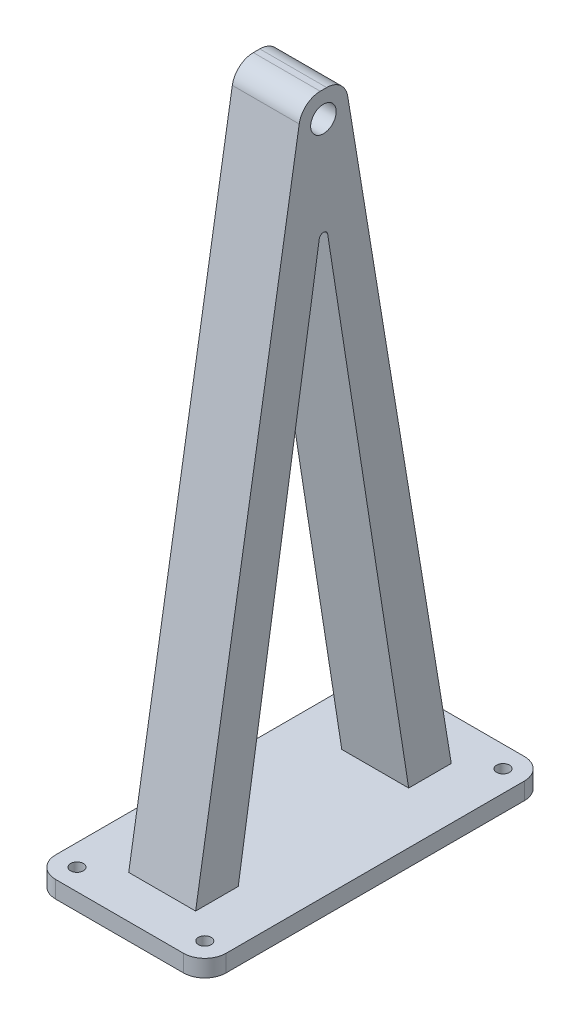
ISO-10303-21;
HEADER;
FILE_DESCRIPTION(('STEP AP214'),'2;1');
FILE_NAME('part.step','',(''),(''),'','','');
FILE_SCHEMA(('AUTOMOTIVE_DESIGN { 1 0 10303 214 1 1 1 1 }'));
ENDSEC;
DATA;
#1=APPLICATION_CONTEXT('core data for automotive mechanical design processes');
#2=APPLICATION_PROTOCOL_DEFINITION('international standard','automotive_design',2000,#1);
#3=PRODUCT_CONTEXT('',#1,'mechanical');
#4=PRODUCT('Part','Part','',(#3));
#5=PRODUCT_RELATED_PRODUCT_CATEGORY('part','',(#4));
#6=PRODUCT_DEFINITION_FORMATION('','',#4);
#7=PRODUCT_DEFINITION_CONTEXT('part definition',#1,'design');
#8=PRODUCT_DEFINITION('design','',#6,#7);
#9=PRODUCT_DEFINITION_SHAPE('','',#8);
#10=(LENGTH_UNIT() NAMED_UNIT(*) SI_UNIT(.MILLI.,.METRE.));
#11=(NAMED_UNIT(*) PLANE_ANGLE_UNIT() SI_UNIT($,.RADIAN.));
#12=(NAMED_UNIT(*) SI_UNIT($,.STERADIAN.) SOLID_ANGLE_UNIT());
#13=UNCERTAINTY_MEASURE_WITH_UNIT(LENGTH_MEASURE(1.E-05),#10,'distance_accuracy_value','');
#14=(GEOMETRIC_REPRESENTATION_CONTEXT(3) GLOBAL_UNCERTAINTY_ASSIGNED_CONTEXT((#13)) GLOBAL_UNIT_ASSIGNED_CONTEXT((#10,
#11,#12)) REPRESENTATION_CONTEXT('',''));
#15=CARTESIAN_POINT('',(0.,0.,0.));
#16=DIRECTION('',(0.,0.,1.));
#17=DIRECTION('',(1.,0.,0.));
#18=AXIS2_PLACEMENT_3D('',#15,#16,#17);
#19=CARTESIAN_POINT('',(0.,4.,0.));
#20=DIRECTION('',(0.,-1.,0.));
#21=DIRECTION('',(0.,0.,-1.));
#22=AXIS2_PLACEMENT_3D('',#19,#20,#21);
#23=PLANE('',#22);
#24=DIRECTION('',(0.,0.,1.));
#25=VECTOR('',#24,1.);
#26=CARTESIAN_POINT('',(0.,4.,0.));
#27=LINE('',#26,#25);
#28=CARTESIAN_POINT('',(0.,4.,-75.));
#29=VERTEX_POINT('',#28);
#30=CARTESIAN_POINT('',(0.,4.,-5.));
#31=VERTEX_POINT('',#30);
#32=EDGE_CURVE('E223',#29,#31,#27,.T.);
#33=ORIENTED_EDGE('',*,*,#32,.T.);
#34=CARTESIAN_POINT('',(5.,4.,-5.));
#35=DIRECTION('',(0.,-1.,0.));
#36=DIRECTION('',(0.,0.,-1.));
#37=AXIS2_PLACEMENT_3D('',#34,#35,#36);
#38=CIRCLE('',#37,5.);
#39=CARTESIAN_POINT('',(5.,4.,0.));
#40=VERTEX_POINT('',#39);
#41=EDGE_CURVE('E265',#31,#40,#38,.F.);
#42=ORIENTED_EDGE('',*,*,#41,.T.);
#43=DIRECTION('',(1.,0.,0.));
#44=VECTOR('',#43,1.);
#45=CARTESIAN_POINT('',(0.,4.,0.));
#46=LINE('',#45,#44);
#47=CARTESIAN_POINT('',(35.,4.,0.));
#48=VERTEX_POINT('',#47);
#49=EDGE_CURVE('E225',#40,#48,#46,.T.);
#50=ORIENTED_EDGE('',*,*,#49,.T.);
#51=CARTESIAN_POINT('',(35.,4.,-5.));
#52=DIRECTION('',(0.,-1.,0.));
#53=DIRECTION('',(0.,0.,-1.));
#54=AXIS2_PLACEMENT_3D('',#51,#52,#53);
#55=CIRCLE('',#54,5.);
#56=CARTESIAN_POINT('',(40.,4.,-5.));
#57=VERTEX_POINT('',#56);
#58=EDGE_CURVE('E267',#48,#57,#55,.F.);
#59=ORIENTED_EDGE('',*,*,#58,.T.);
#60=DIRECTION('',(0.,0.,-1.));
#61=VECTOR('',#60,1.);
#62=CARTESIAN_POINT('',(40.,4.,0.));
#63=LINE('',#62,#61);
#64=CARTESIAN_POINT('',(40.,4.,-75.));
#65=VERTEX_POINT('',#64);
#66=EDGE_CURVE('E229',#57,#65,#63,.T.);
#67=ORIENTED_EDGE('',*,*,#66,.T.);
#68=CARTESIAN_POINT('',(35.,4.,-75.));
#69=DIRECTION('',(0.,-1.,0.));
#70=DIRECTION('',(0.,0.,-1.));
#71=AXIS2_PLACEMENT_3D('',#68,#69,#70);
#72=CIRCLE('',#71,5.);
#73=CARTESIAN_POINT('',(35.,4.,-80.));
#74=VERTEX_POINT('',#73);
#75=EDGE_CURVE('E269',#65,#74,#72,.F.);
#76=ORIENTED_EDGE('',*,*,#75,.T.);
#77=DIRECTION('',(-1.,0.,0.));
#78=VECTOR('',#77,1.);
#79=CARTESIAN_POINT('',(0.,4.,-80.));
#80=LINE('',#79,#78);
#81=CARTESIAN_POINT('',(5.,4.,-80.));
#82=VERTEX_POINT('',#81);
#83=EDGE_CURVE('E231',#74,#82,#80,.T.);
#84=ORIENTED_EDGE('',*,*,#83,.T.);
#85=CARTESIAN_POINT('',(5.,4.,-75.));
#86=DIRECTION('',(0.,-1.,0.));
#87=DIRECTION('',(0.,0.,-1.));
#88=AXIS2_PLACEMENT_3D('',#85,#86,#87);
#89=CIRCLE('',#88,5.);
#90=EDGE_CURVE('E263',#82,#29,#89,.F.);
#91=ORIENTED_EDGE('',*,*,#90,.T.);
#92=EDGE_LOOP('',(#33,#42,#50,#59,#67,#76,#84,#91));
#93=FACE_BOUND('',#92,.T.);
#94=DIRECTION('',(1.,0.,0.));
#95=VECTOR('',#94,1.);
#96=CARTESIAN_POINT('',(-132.15,4.,-60.));
#97=LINE('',#96,#95);
#98=CARTESIAN_POINT('',(12.15,4.,-60.));
#99=VERTEX_POINT('',#98);
#100=CARTESIAN_POINT('',(27.85,3.99999999999999,-60.));
#101=VERTEX_POINT('',#100);
#102=EDGE_CURVE('E172',#99,#101,#97,.T.);
#103=ORIENTED_EDGE('',*,*,#102,.F.);
#104=DIRECTION('',(0.,0.,1.));
#105=VECTOR('',#104,1.);
#106=CARTESIAN_POINT('',(12.15,4.,-70.));
#107=LINE('',#106,#105);
#108=CARTESIAN_POINT('',(12.15,4.,-70.));
#109=VERTEX_POINT('',#108);
#110=EDGE_CURVE('E326',#109,#99,#107,.T.);
#111=ORIENTED_EDGE('',*,*,#110,.F.);
#112=DIRECTION('',(-1.,0.,0.));
#113=VECTOR('',#112,1.);
#114=CARTESIAN_POINT('',(12.15,4.,-70.));
#115=LINE('',#114,#113);
#116=CARTESIAN_POINT('',(27.85,4.,-70.));
#117=VERTEX_POINT('',#116);
#118=EDGE_CURVE('E187',#117,#109,#115,.T.);
#119=ORIENTED_EDGE('',*,*,#118,.F.);
#120=DIRECTION('',(0.,0.,-1.));
#121=VECTOR('',#120,1.);
#122=CARTESIAN_POINT('',(27.85,4.,-70.));
#123=LINE('',#122,#121);
#124=EDGE_CURVE('E188',#101,#117,#123,.T.);
#125=ORIENTED_EDGE('',*,*,#124,.F.);
#126=EDGE_LOOP('',(#103,#111,#119,#125));
#127=FACE_BOUND('',#126,.T.);
#128=CARTESIAN_POINT('',(35.,4.,-5.));
#129=DIRECTION('',(0.,1.,0.));
#130=DIRECTION('',(0.,0.,1.));
#131=AXIS2_PLACEMENT_3D('',#128,#129,#130);
#132=CIRCLE('',#131,1.5);
#133=CARTESIAN_POINT('',(35.,4.,-3.5));
#134=VERTEX_POINT('',#133);
#135=EDGE_CURVE('E197',#134,#134,#132,.T.);
#136=ORIENTED_EDGE('',*,*,#135,.F.);
#137=EDGE_LOOP('',(#136));
#138=FACE_BOUND('',#137,.T.);
#139=CARTESIAN_POINT('',(5.,4.,-5.));
#140=DIRECTION('',(0.,1.,0.));
#141=DIRECTION('',(0.,0.,1.));
#142=AXIS2_PLACEMENT_3D('',#139,#140,#141);
#143=CIRCLE('',#142,1.5);
#144=CARTESIAN_POINT('',(5.,4.,-3.5));
#145=VERTEX_POINT('',#144);
#146=EDGE_CURVE('E205',#145,#145,#143,.T.);
#147=ORIENTED_EDGE('',*,*,#146,.F.);
#148=EDGE_LOOP('',(#147));
#149=FACE_BOUND('',#148,.T.);
#150=CARTESIAN_POINT('',(12.15,4.,-20.));
#151=VERTEX_POINT('',#150);
#152=CARTESIAN_POINT('',(12.15,4.,-10.));
#153=VERTEX_POINT('',#152);
#154=EDGE_CURVE('E180',#151,#153,#107,.T.);
#155=ORIENTED_EDGE('',*,*,#154,.F.);
#156=DIRECTION('',(1.,0.,0.));
#157=VECTOR('',#156,1.);
#158=CARTESIAN_POINT('',(-132.15,4.,-20.));
#159=LINE('',#158,#157);
#160=CARTESIAN_POINT('',(27.85,4.,-20.));
#161=VERTEX_POINT('',#160);
#162=EDGE_CURVE('E167',#151,#161,#159,.T.);
#163=ORIENTED_EDGE('',*,*,#162,.T.);
#164=CARTESIAN_POINT('',(27.85,4.,-10.));
#165=VERTEX_POINT('',#164);
#166=EDGE_CURVE('E179',#165,#161,#123,.T.);
#167=ORIENTED_EDGE('',*,*,#166,.F.);
#168=DIRECTION('',(1.,0.,0.));
#169=VECTOR('',#168,1.);
#170=CARTESIAN_POINT('',(12.15,4.,-10.));
#171=LINE('',#170,#169);
#172=EDGE_CURVE('E193',#153,#165,#171,.T.);
#173=ORIENTED_EDGE('',*,*,#172,.F.);
#174=EDGE_LOOP('',(#155,#163,#167,#173));
#175=FACE_BOUND('',#174,.T.);
#176=CARTESIAN_POINT('',(5.,4.,-75.));
#177=DIRECTION('',(0.,1.,0.));
#178=DIRECTION('',(0.,0.,1.));
#179=AXIS2_PLACEMENT_3D('',#176,#177,#178);
#180=CIRCLE('',#179,1.54);
#181=CARTESIAN_POINT('',(5.,4.,-73.46));
#182=VERTEX_POINT('',#181);
#183=EDGE_CURVE('E217',#182,#182,#180,.T.);
#184=ORIENTED_EDGE('',*,*,#183,.F.);
#185=EDGE_LOOP('',(#184));
#186=FACE_BOUND('',#185,.T.);
#187=CARTESIAN_POINT('',(35.,4.,-75.));
#188=DIRECTION('',(0.,1.,0.));
#189=DIRECTION('',(0.,0.,1.));
#190=AXIS2_PLACEMENT_3D('',#187,#188,#189);
#191=CIRCLE('',#190,1.5);
#192=CARTESIAN_POINT('',(35.,4.,-73.5));
#193=VERTEX_POINT('',#192);
#194=EDGE_CURVE('E211',#193,#193,#191,.T.);
#195=ORIENTED_EDGE('',*,*,#194,.F.);
#196=EDGE_LOOP('',(#195));
#197=FACE_BOUND('',#196,.T.);
#198=ADVANCED_FACE('F39',(#93,#127,#138,#149,#175,#186,#197),#23,.F.);
#199=CARTESIAN_POINT('',(0.,0.,0.));
#200=DIRECTION('',(0.,-1.,0.));
#201=DIRECTION('',(0.,0.,-1.));
#202=AXIS2_PLACEMENT_3D('',#199,#200,#201);
#203=PLANE('',#202);
#204=CARTESIAN_POINT('',(5.,0.,-5.));
#205=DIRECTION('',(0.,1.,0.));
#206=DIRECTION('',(0.,0.,1.));
#207=AXIS2_PLACEMENT_3D('',#204,#205,#206);
#208=CIRCLE('',#207,1.5);
#209=CARTESIAN_POINT('',(5.,0.,-3.5));
#210=VERTEX_POINT('',#209);
#211=EDGE_CURVE('E200',#210,#210,#208,.T.);
#212=ORIENTED_EDGE('',*,*,#211,.T.);
#213=EDGE_LOOP('',(#212));
#214=FACE_BOUND('',#213,.T.);
#215=CARTESIAN_POINT('',(5.,0.,-75.));
#216=DIRECTION('',(0.,1.,0.));
#217=DIRECTION('',(0.,0.,1.));
#218=AXIS2_PLACEMENT_3D('',#215,#216,#217);
#219=CIRCLE('',#218,1.54);
#220=CARTESIAN_POINT('',(5.,0.,-73.46));
#221=VERTEX_POINT('',#220);
#222=EDGE_CURVE('E214',#221,#221,#219,.T.);
#223=ORIENTED_EDGE('',*,*,#222,.T.);
#224=EDGE_LOOP('',(#223));
#225=FACE_BOUND('',#224,.T.);
#226=DIRECTION('',(-1.,0.,0.));
#227=VECTOR('',#226,1.);
#228=CARTESIAN_POINT('',(0.,0.,-80.));
#229=LINE('',#228,#227);
#230=CARTESIAN_POINT('',(35.,0.,-80.));
#231=VERTEX_POINT('',#230);
#232=CARTESIAN_POINT('',(5.,0.,-80.));
#233=VERTEX_POINT('',#232);
#234=EDGE_CURVE('E226',#231,#233,#229,.T.);
#235=ORIENTED_EDGE('',*,*,#234,.F.);
#236=CARTESIAN_POINT('',(35.,0.,-75.));
#237=DIRECTION('',(0.,-1.,0.));
#238=DIRECTION('',(0.,0.,-1.));
#239=AXIS2_PLACEMENT_3D('',#236,#237,#238);
#240=CIRCLE('',#239,5.);
#241=CARTESIAN_POINT('',(40.,0.,-75.));
#242=VERTEX_POINT('',#241);
#243=EDGE_CURVE('E255',#231,#242,#240,.T.);
#244=ORIENTED_EDGE('',*,*,#243,.T.);
#245=DIRECTION('',(0.,0.,-1.));
#246=VECTOR('',#245,1.);
#247=CARTESIAN_POINT('',(40.,0.,0.));
#248=LINE('',#247,#246);
#249=CARTESIAN_POINT('',(40.,0.,-5.));
#250=VERTEX_POINT('',#249);
#251=EDGE_CURVE('E240',#250,#242,#248,.T.);
#252=ORIENTED_EDGE('',*,*,#251,.F.);
#253=CARTESIAN_POINT('',(35.,0.,-5.));
#254=DIRECTION('',(0.,-1.,0.));
#255=DIRECTION('',(0.,0.,-1.));
#256=AXIS2_PLACEMENT_3D('',#253,#254,#255);
#257=CIRCLE('',#256,5.);
#258=CARTESIAN_POINT('',(35.,0.,0.));
#259=VERTEX_POINT('',#258);
#260=EDGE_CURVE('E253',#250,#259,#257,.T.);
#261=ORIENTED_EDGE('',*,*,#260,.T.);
#262=DIRECTION('',(1.,0.,0.));
#263=VECTOR('',#262,1.);
#264=CARTESIAN_POINT('',(0.,0.,0.));
#265=LINE('',#264,#263);
#266=CARTESIAN_POINT('',(5.,0.,0.));
#267=VERTEX_POINT('',#266);
#268=EDGE_CURVE('E237',#267,#259,#265,.T.);
#269=ORIENTED_EDGE('',*,*,#268,.F.);
#270=CARTESIAN_POINT('',(5.,0.,-5.));
#271=DIRECTION('',(0.,-1.,0.));
#272=DIRECTION('',(0.,0.,-1.));
#273=AXIS2_PLACEMENT_3D('',#270,#271,#272);
#274=CIRCLE('',#273,5.);
#275=CARTESIAN_POINT('',(0.,0.,-5.));
#276=VERTEX_POINT('',#275);
#277=EDGE_CURVE('E251',#267,#276,#274,.T.);
#278=ORIENTED_EDGE('',*,*,#277,.T.);
#279=DIRECTION('',(0.,0.,1.));
#280=VECTOR('',#279,1.);
#281=CARTESIAN_POINT('',(0.,0.,0.));
#282=LINE('',#281,#280);
#283=CARTESIAN_POINT('',(0.,0.,-75.));
#284=VERTEX_POINT('',#283);
#285=EDGE_CURVE('E220',#284,#276,#282,.T.);
#286=ORIENTED_EDGE('',*,*,#285,.F.);
#287=CARTESIAN_POINT('',(5.,0.,-75.));
#288=DIRECTION('',(0.,-1.,0.));
#289=DIRECTION('',(0.,0.,-1.));
#290=AXIS2_PLACEMENT_3D('',#287,#288,#289);
#291=CIRCLE('',#290,5.);
#292=EDGE_CURVE('E249',#284,#233,#291,.T.);
#293=ORIENTED_EDGE('',*,*,#292,.T.);
#294=EDGE_LOOP('',(#235,#244,#252,#261,#269,#278,#286,#293));
#295=FACE_BOUND('',#294,.T.);
#296=CARTESIAN_POINT('',(35.,0.,-75.));
#297=DIRECTION('',(0.,1.,0.));
#298=DIRECTION('',(0.,0.,1.));
#299=AXIS2_PLACEMENT_3D('',#296,#297,#298);
#300=CIRCLE('',#299,1.5);
#301=CARTESIAN_POINT('',(35.,0.,-73.5));
#302=VERTEX_POINT('',#301);
#303=EDGE_CURVE('E208',#302,#302,#300,.T.);
#304=ORIENTED_EDGE('',*,*,#303,.T.);
#305=EDGE_LOOP('',(#304));
#306=FACE_BOUND('',#305,.T.);
#307=CARTESIAN_POINT('',(35.,0.,-5.));
#308=DIRECTION('',(0.,1.,0.));
#309=DIRECTION('',(0.,0.,1.));
#310=AXIS2_PLACEMENT_3D('',#307,#308,#309);
#311=CIRCLE('',#310,1.5);
#312=CARTESIAN_POINT('',(35.,0.,-3.5));
#313=VERTEX_POINT('',#312);
#314=EDGE_CURVE('E201',#313,#313,#311,.T.);
#315=ORIENTED_EDGE('',*,*,#314,.T.);
#316=EDGE_LOOP('',(#315));
#317=FACE_BOUND('',#316,.T.);
#318=ADVANCED_FACE('F365',(#214,#225,#295,#306,#317),#203,.T.);
#319=CARTESIAN_POINT('',(0.,4.,0.));
#320=DIRECTION('',(1.,0.,0.));
#321=DIRECTION('',(0.,0.,-1.));
#322=AXIS2_PLACEMENT_3D('',#319,#320,#321);
#323=PLANE('',#322);
#324=ORIENTED_EDGE('',*,*,#285,.T.);
#325=DIRECTION('',(0.,-1.,0.));
#326=VECTOR('',#325,1.);
#327=CARTESIAN_POINT('',(0.,4.,-5.));
#328=LINE('',#327,#326);
#329=EDGE_CURVE('E279',#276,#31,#328,.F.);
#330=ORIENTED_EDGE('',*,*,#329,.T.);
#331=ORIENTED_EDGE('',*,*,#32,.F.);
#332=DIRECTION('',(0.,-1.,0.));
#333=VECTOR('',#332,1.);
#334=CARTESIAN_POINT('',(0.,4.,-75.));
#335=LINE('',#334,#333);
#336=EDGE_CURVE('E276',#29,#284,#335,.T.);
#337=ORIENTED_EDGE('',*,*,#336,.T.);
#338=EDGE_LOOP('',(#324,#330,#331,#337));
#339=FACE_BOUND('',#338,.T.);
#340=ADVANCED_FACE('F372',(#339),#323,.F.);
#341=CARTESIAN_POINT('',(0.,4.,0.));
#342=DIRECTION('',(0.,0.,-1.));
#343=DIRECTION('',(-1.,0.,0.));
#344=AXIS2_PLACEMENT_3D('',#341,#342,#343);
#345=PLANE('',#344);
#346=ORIENTED_EDGE('',*,*,#268,.T.);
#347=DIRECTION('',(0.,-1.,0.));
#348=VECTOR('',#347,1.);
#349=CARTESIAN_POINT('',(35.,4.,0.));
#350=LINE('',#349,#348);
#351=EDGE_CURVE('E274',#259,#48,#350,.F.);
#352=ORIENTED_EDGE('',*,*,#351,.T.);
#353=ORIENTED_EDGE('',*,*,#49,.F.);
#354=DIRECTION('',(0.,-1.,0.));
#355=VECTOR('',#354,1.);
#356=CARTESIAN_POINT('',(5.,4.,0.));
#357=LINE('',#356,#355);
#358=EDGE_CURVE('E271',#40,#267,#357,.T.);
#359=ORIENTED_EDGE('',*,*,#358,.T.);
#360=EDGE_LOOP('',(#346,#352,#353,#359));
#361=FACE_BOUND('',#360,.T.);
#362=ADVANCED_FACE('F386',(#361),#345,.F.);
#363=CARTESIAN_POINT('',(40.,4.,0.));
#364=DIRECTION('',(-1.,0.,0.));
#365=DIRECTION('',(0.,0.,1.));
#366=AXIS2_PLACEMENT_3D('',#363,#364,#365);
#367=PLANE('',#366);
#368=ORIENTED_EDGE('',*,*,#251,.T.);
#369=DIRECTION('',(0.,-1.,0.));
#370=VECTOR('',#369,1.);
#371=CARTESIAN_POINT('',(40.,4.,-75.));
#372=LINE('',#371,#370);
#373=EDGE_CURVE('E260',#242,#65,#372,.F.);
#374=ORIENTED_EDGE('',*,*,#373,.T.);
#375=ORIENTED_EDGE('',*,*,#66,.F.);
#376=DIRECTION('',(0.,-1.,0.));
#377=VECTOR('',#376,1.);
#378=CARTESIAN_POINT('',(40.,4.,-5.));
#379=LINE('',#378,#377);
#380=EDGE_CURVE('E257',#57,#250,#379,.T.);
#381=ORIENTED_EDGE('',*,*,#380,.T.);
#382=EDGE_LOOP('',(#368,#374,#375,#381));
#383=FACE_BOUND('',#382,.T.);
#384=ADVANCED_FACE('F382',(#383),#367,.F.);
#385=CARTESIAN_POINT('',(0.,4.,-80.));
#386=DIRECTION('',(0.,0.,1.));
#387=DIRECTION('',(1.,0.,0.));
#388=AXIS2_PLACEMENT_3D('',#385,#386,#387);
#389=PLANE('',#388);
#390=ORIENTED_EDGE('',*,*,#83,.F.);
#391=DIRECTION('',(0.,-1.,0.));
#392=VECTOR('',#391,1.);
#393=CARTESIAN_POINT('',(35.,4.,-80.));
#394=LINE('',#393,#392);
#395=EDGE_CURVE('E246',#74,#231,#394,.T.);
#396=ORIENTED_EDGE('',*,*,#395,.T.);
#397=ORIENTED_EDGE('',*,*,#234,.T.);
#398=DIRECTION('',(0.,-1.,0.));
#399=VECTOR('',#398,1.);
#400=CARTESIAN_POINT('',(5.,4.,-80.));
#401=LINE('',#400,#399);
#402=EDGE_CURVE('E234',#233,#82,#401,.F.);
#403=ORIENTED_EDGE('',*,*,#402,.T.);
#404=EDGE_LOOP('',(#390,#396,#397,#403));
#405=FACE_BOUND('',#404,.T.);
#406=ADVANCED_FACE('F379',(#405),#389,.F.);
#407=CARTESIAN_POINT('',(5.,4.,-75.));
#408=DIRECTION('',(0.,-1.,0.));
#409=DIRECTION('',(0.,0.,-1.));
#410=AXIS2_PLACEMENT_3D('',#407,#408,#409);
#411=CYLINDRICAL_SURFACE('',#410,1.54);
#412=ORIENTED_EDGE('',*,*,#183,.T.);
#413=EDGE_LOOP('',(#412));
#414=FACE_BOUND('',#413,.T.);
#415=ORIENTED_EDGE('',*,*,#222,.F.);
#416=EDGE_LOOP('',(#415));
#417=FACE_BOUND('',#416,.T.);
#418=ADVANCED_FACE('F376',(#414,#417),#411,.F.);
#419=CARTESIAN_POINT('',(35.,4.,-75.));
#420=DIRECTION('',(0.,-1.,0.));
#421=DIRECTION('',(0.,0.,-1.));
#422=AXIS2_PLACEMENT_3D('',#419,#420,#421);
#423=CYLINDRICAL_SURFACE('',#422,1.5);
#424=ORIENTED_EDGE('',*,*,#194,.T.);
#425=EDGE_LOOP('',(#424));
#426=FACE_BOUND('',#425,.T.);
#427=ORIENTED_EDGE('',*,*,#303,.F.);
#428=EDGE_LOOP('',(#427));
#429=FACE_BOUND('',#428,.T.);
#430=ADVANCED_FACE('F448',(#426,#429),#423,.F.);
#431=CARTESIAN_POINT('',(5.,4.,-5.));
#432=DIRECTION('',(0.,-1.,0.));
#433=DIRECTION('',(0.,0.,-1.));
#434=AXIS2_PLACEMENT_3D('',#431,#432,#433);
#435=CYLINDRICAL_SURFACE('',#434,1.5);
#436=ORIENTED_EDGE('',*,*,#146,.T.);
#437=EDGE_LOOP('',(#436));
#438=FACE_BOUND('',#437,.T.);
#439=ORIENTED_EDGE('',*,*,#211,.F.);
#440=EDGE_LOOP('',(#439));
#441=FACE_BOUND('',#440,.T.);
#442=ADVANCED_FACE('F442',(#438,#441),#435,.F.);
#443=CARTESIAN_POINT('',(35.,4.,-5.));
#444=DIRECTION('',(0.,-1.,0.));
#445=DIRECTION('',(0.,0.,-1.));
#446=AXIS2_PLACEMENT_3D('',#443,#444,#445);
#447=CYLINDRICAL_SURFACE('',#446,1.5);
#448=ORIENTED_EDGE('',*,*,#135,.T.);
#449=EDGE_LOOP('',(#448));
#450=FACE_BOUND('',#449,.T.);
#451=ORIENTED_EDGE('',*,*,#314,.F.);
#452=EDGE_LOOP('',(#451));
#453=FACE_BOUND('',#452,.T.);
#454=ADVANCED_FACE('F397',(#450,#453),#447,.F.);
#455=CARTESIAN_POINT('',(35.,4.,-75.));
#456=DIRECTION('',(0.,-1.,0.));
#457=DIRECTION('',(0.,0.,-1.));
#458=AXIS2_PLACEMENT_3D('',#455,#456,#457);
#459=CYLINDRICAL_SURFACE('',#458,5.);
#460=ORIENTED_EDGE('',*,*,#75,.F.);
#461=ORIENTED_EDGE('',*,*,#373,.F.);
#462=ORIENTED_EDGE('',*,*,#243,.F.);
#463=ORIENTED_EDGE('',*,*,#395,.F.);
#464=EDGE_LOOP('',(#460,#461,#462,#463));
#465=FACE_BOUND('',#464,.T.);
#466=ADVANCED_FACE('F393',(#465),#459,.T.);
#467=CARTESIAN_POINT('',(35.,4.,-5.));
#468=DIRECTION('',(0.,-1.,0.));
#469=DIRECTION('',(0.,0.,-1.));
#470=AXIS2_PLACEMENT_3D('',#467,#468,#469);
#471=CYLINDRICAL_SURFACE('',#470,5.);
#472=ORIENTED_EDGE('',*,*,#58,.F.);
#473=ORIENTED_EDGE('',*,*,#351,.F.);
#474=ORIENTED_EDGE('',*,*,#260,.F.);
#475=ORIENTED_EDGE('',*,*,#380,.F.);
#476=EDGE_LOOP('',(#472,#473,#474,#475));
#477=FACE_BOUND('',#476,.T.);
#478=ADVANCED_FACE('F396',(#477),#471,.T.);
#479=CARTESIAN_POINT('',(5.,4.,-5.));
#480=DIRECTION('',(0.,-1.,0.));
#481=DIRECTION('',(0.,0.,-1.));
#482=AXIS2_PLACEMENT_3D('',#479,#480,#481);
#483=CYLINDRICAL_SURFACE('',#482,5.);
#484=ORIENTED_EDGE('',*,*,#41,.F.);
#485=ORIENTED_EDGE('',*,*,#329,.F.);
#486=ORIENTED_EDGE('',*,*,#277,.F.);
#487=ORIENTED_EDGE('',*,*,#358,.F.);
#488=EDGE_LOOP('',(#484,#485,#486,#487));
#489=FACE_BOUND('',#488,.T.);
#490=ADVANCED_FACE('F401',(#489),#483,.T.);
#491=CARTESIAN_POINT('',(5.,4.,-75.));
#492=DIRECTION('',(0.,-1.,0.));
#493=DIRECTION('',(0.,0.,-1.));
#494=AXIS2_PLACEMENT_3D('',#491,#492,#493);
#495=CYLINDRICAL_SURFACE('',#494,5.);
#496=ORIENTED_EDGE('',*,*,#90,.F.);
#497=ORIENTED_EDGE('',*,*,#402,.F.);
#498=ORIENTED_EDGE('',*,*,#292,.F.);
#499=ORIENTED_EDGE('',*,*,#336,.F.);
#500=EDGE_LOOP('',(#496,#497,#498,#499));
#501=FACE_BOUND('',#500,.T.);
#502=ADVANCED_FACE('F405',(#501),#495,.T.);
#503=CARTESIAN_POINT('',(12.15,156.,-70.));
#504=DIRECTION('',(1.,0.,0.));
#505=DIRECTION('',(0.,0.,-1.));
#506=AXIS2_PLACEMENT_3D('',#503,#504,#505);
#507=PLANE('',#506);
#508=CARTESIAN_POINT('',(12.15,150.,-40.));
#509=DIRECTION('',(1.,0.,0.));
#510=DIRECTION('',(0.,0.,-1.));
#511=AXIS2_PLACEMENT_3D('',#508,#509,#510);
#512=CIRCLE('',#511,3.);
#513=CARTESIAN_POINT('',(12.15,150.,-43.));
#514=VERTEX_POINT('',#513);
#515=EDGE_CURVE('E286',#514,#514,#512,.T.);
#516=ORIENTED_EDGE('',*,*,#515,.T.);
#517=EDGE_LOOP('',(#516));
#518=FACE_BOUND('',#517,.T.);
#519=DIRECTION('',(0.,0.988094813743472,0.153846153846154));
#520=VECTOR('',#519,1.);
#521=CARTESIAN_POINT('',(12.15,150.882220996608,-37.1304692076083));
#522=LINE('',#521,#520);
#523=CARTESIAN_POINT('',(12.15,126.106171940497,-40.9880948137435));
#524=VERTEX_POINT('',#523);
#525=EDGE_CURVE('E181',#99,#524,#522,.T.);
#526=ORIENTED_EDGE('',*,*,#525,.T.);
#527=CARTESIAN_POINT('',(12.15,125.952325786651,-40.));
#528=DIRECTION('',(1.,0.,0.));
#529=DIRECTION('',(0.,0.,-1.));
#530=AXIS2_PLACEMENT_3D('',#527,#528,#529);
#531=CIRCLE('',#530,1.);
#532=CARTESIAN_POINT('',(12.15,126.106171940497,-39.0119051862565));
#533=VERTEX_POINT('',#532);
#534=EDGE_CURVE('E11',#524,#533,#531,.T.);
#535=ORIENTED_EDGE('',*,*,#534,.T.);
#536=DIRECTION('',(0.,-0.988094813743472,0.153846153846154));
#537=VECTOR('',#536,1.);
#538=CARTESIAN_POINT('',(12.15,160.003096200394,-44.289649135587));
#539=LINE('',#538,#537);
#540=EDGE_CURVE('E339',#533,#151,#539,.T.);
#541=ORIENTED_EDGE('',*,*,#540,.T.);
#542=ORIENTED_EDGE('',*,*,#154,.T.);
#543=DIRECTION('',(0.,0.986742581039056,-0.162293187670897));
#544=VECTOR('',#543,1.);
#545=CARTESIAN_POINT('',(12.15,161.60495596106,-35.9218677567533));
#546=LINE('',#545,#544);
#547=CARTESIAN_POINT('',(12.15,151.811465938354,-34.3110963714399));
#548=VERTEX_POINT('',#547);
#549=EDGE_CURVE('E287',#153,#548,#546,.T.);
#550=ORIENTED_EDGE('',*,*,#549,.T.);
#551=CARTESIAN_POINT('',(12.15,151.,-39.2448092766352));
#552=DIRECTION('',(1.,0.,0.));
#553=DIRECTION('',(0.,0.,-1.));
#554=AXIS2_PLACEMENT_3D('',#551,#552,#553);
#555=CIRCLE('',#554,5.);
#556=CARTESIAN_POINT('',(12.15,156.,-39.2448092766352));
#557=VERTEX_POINT('',#556);
#558=EDGE_CURVE('E298',#548,#557,#555,.F.);
#559=ORIENTED_EDGE('',*,*,#558,.T.);
#560=DIRECTION('',(0.,0.,1.));
#561=VECTOR('',#560,1.);
#562=CARTESIAN_POINT('',(12.15,156.,-70.));
#563=LINE('',#562,#561);
#564=CARTESIAN_POINT('',(12.15,156.,-40.7551907233648));
#565=VERTEX_POINT('',#564);
#566=EDGE_CURVE('E191',#565,#557,#563,.T.);
#567=ORIENTED_EDGE('',*,*,#566,.F.);
#568=CARTESIAN_POINT('',(12.15,151.,-40.7551907233648));
#569=DIRECTION('',(1.,0.,0.));
#570=DIRECTION('',(0.,0.,-1.));
#571=AXIS2_PLACEMENT_3D('',#568,#569,#570);
#572=CIRCLE('',#571,5.);
#573=CARTESIAN_POINT('',(12.15,151.811465938354,-45.6889036285601));
#574=VERTEX_POINT('',#573);
#575=EDGE_CURVE('E300',#565,#574,#572,.F.);
#576=ORIENTED_EDGE('',*,*,#575,.T.);
#577=DIRECTION('',(0.,-0.986742581039056,-0.162293187670897));
#578=VECTOR('',#577,1.);
#579=CARTESIAN_POINT('',(12.15,151.996460027814,-45.6584769691095));
#580=LINE('',#579,#578);
#581=EDGE_CURVE('E318',#574,#109,#580,.T.);
#582=ORIENTED_EDGE('',*,*,#581,.T.);
#583=ORIENTED_EDGE('',*,*,#110,.T.);
#584=EDGE_LOOP('',(#526,#535,#541,#542,#550,#559,#567,#576,#582,#583));
#585=FACE_BOUND('',#584,.T.);
#586=ADVANCED_FACE('F314',(#518,#585),#507,.F.);
#587=CARTESIAN_POINT('',(27.85,156.,-70.));
#588=DIRECTION('',(-1.,0.,0.));
#589=DIRECTION('',(0.,0.,1.));
#590=AXIS2_PLACEMENT_3D('',#587,#588,#589);
#591=PLANE('',#590);
#592=CARTESIAN_POINT('',(27.85,150.,-40.));
#593=DIRECTION('',(-1.,0.,0.));
#594=DIRECTION('',(0.,0.,1.));
#595=AXIS2_PLACEMENT_3D('',#592,#593,#594);
#596=CIRCLE('',#595,3.);
#597=CARTESIAN_POINT('',(27.85,150.,-37.));
#598=VERTEX_POINT('',#597);
#599=EDGE_CURVE('E283',#598,#598,#596,.T.);
#600=ORIENTED_EDGE('',*,*,#599,.T.);
#601=EDGE_LOOP('',(#600));
#602=FACE_BOUND('',#601,.T.);
#603=ORIENTED_EDGE('',*,*,#166,.T.);
#604=DIRECTION('',(0.,-0.988094813743471,0.153846153846154));
#605=VECTOR('',#604,1.);
#606=CARTESIAN_POINT('',(27.85,4.,-20.));
#607=LINE('',#606,#605);
#608=CARTESIAN_POINT('',(27.85,126.106171940497,-39.0119051862565));
#609=VERTEX_POINT('',#608);
#610=EDGE_CURVE('E163',#609,#161,#607,.T.);
#611=ORIENTED_EDGE('',*,*,#610,.F.);
#612=CARTESIAN_POINT('',(27.85,125.952325786651,-40.));
#613=DIRECTION('',(-1.,0.,0.));
#614=DIRECTION('',(0.,0.,1.));
#615=AXIS2_PLACEMENT_3D('',#612,#613,#614);
#616=CIRCLE('',#615,1.);
#617=CARTESIAN_POINT('',(27.85,126.106171940497,-40.9880948137435));
#618=VERTEX_POINT('',#617);
#619=EDGE_CURVE('E47',#609,#618,#616,.T.);
#620=ORIENTED_EDGE('',*,*,#619,.T.);
#621=DIRECTION('',(0.,0.988094813743471,0.153846153846154));
#622=VECTOR('',#621,1.);
#623=CARTESIAN_POINT('',(27.85,132.452325786651,-40.));
#624=LINE('',#623,#622);
#625=EDGE_CURVE('E173',#101,#618,#624,.T.);
#626=ORIENTED_EDGE('',*,*,#625,.F.);
#627=ORIENTED_EDGE('',*,*,#124,.T.);
#628=DIRECTION('',(0.,0.986742581039056,0.162293187670897));
#629=VECTOR('',#628,1.);
#630=CARTESIAN_POINT('',(27.85,151.996460027814,-45.6584769691095));
#631=LINE('',#630,#629);
#632=CARTESIAN_POINT('',(27.85,151.811465938354,-45.6889036285601));
#633=VERTEX_POINT('',#632);
#634=EDGE_CURVE('E341',#117,#633,#631,.T.);
#635=ORIENTED_EDGE('',*,*,#634,.T.);
#636=CARTESIAN_POINT('',(27.85,151.,-40.7551907233648));
#637=DIRECTION('',(-1.,0.,0.));
#638=DIRECTION('',(0.,0.,1.));
#639=AXIS2_PLACEMENT_3D('',#636,#637,#638);
#640=CIRCLE('',#639,5.);
#641=CARTESIAN_POINT('',(27.85,156.,-40.7551907233648));
#642=VERTEX_POINT('',#641);
#643=EDGE_CURVE('E292',#633,#642,#640,.F.);
#644=ORIENTED_EDGE('',*,*,#643,.T.);
#645=DIRECTION('',(0.,0.,-1.));
#646=VECTOR('',#645,1.);
#647=CARTESIAN_POINT('',(27.85,156.,-70.));
#648=LINE('',#647,#646);
#649=CARTESIAN_POINT('',(27.85,156.,-39.2448092766352));
#650=VERTEX_POINT('',#649);
#651=EDGE_CURVE('E204',#650,#642,#648,.T.);
#652=ORIENTED_EDGE('',*,*,#651,.F.);
#653=CARTESIAN_POINT('',(27.85,151.,-39.2448092766352));
#654=DIRECTION('',(-1.,0.,0.));
#655=DIRECTION('',(0.,0.,1.));
#656=AXIS2_PLACEMENT_3D('',#653,#654,#655);
#657=CIRCLE('',#656,5.);
#658=CARTESIAN_POINT('',(27.85,151.811465938354,-34.3110963714399));
#659=VERTEX_POINT('',#658);
#660=EDGE_CURVE('E290',#650,#659,#657,.F.);
#661=ORIENTED_EDGE('',*,*,#660,.T.);
#662=DIRECTION('',(0.,-0.986742581039056,0.162293187670897));
#663=VECTOR('',#662,1.);
#664=CARTESIAN_POINT('',(27.85,161.60495596106,-35.9218677567533));
#665=LINE('',#664,#663);
#666=EDGE_CURVE('E185',#659,#165,#665,.T.);
#667=ORIENTED_EDGE('',*,*,#666,.T.);
#668=EDGE_LOOP('',(#603,#611,#620,#626,#627,#635,#644,#652,#661,#667));
#669=FACE_BOUND('',#668,.T.);
#670=ADVANCED_FACE('F183',(#602,#669),#591,.F.);
#671=CARTESIAN_POINT('',(0.,156.,0.));
#672=DIRECTION('',(0.,1.,0.));
#673=DIRECTION('',(0.,0.,1.));
#674=AXIS2_PLACEMENT_3D('',#671,#672,#673);
#675=PLANE('',#674);
#676=ORIENTED_EDGE('',*,*,#651,.T.);
#677=DIRECTION('',(1.,0.,0.));
#678=VECTOR('',#677,1.);
#679=CARTESIAN_POINT('',(12.15,156.,-40.7551907233648));
#680=LINE('',#679,#678);
#681=EDGE_CURVE('E296',#642,#565,#680,.F.);
#682=ORIENTED_EDGE('',*,*,#681,.T.);
#683=ORIENTED_EDGE('',*,*,#566,.T.);
#684=DIRECTION('',(-1.,0.,0.));
#685=VECTOR('',#684,1.);
#686=CARTESIAN_POINT('',(27.85,156.,-39.2448092766352));
#687=LINE('',#686,#685);
#688=EDGE_CURVE('E294',#557,#650,#687,.F.);
#689=ORIENTED_EDGE('',*,*,#688,.T.);
#690=EDGE_LOOP('',(#676,#682,#683,#689));
#691=FACE_BOUND('',#690,.T.);
#692=ADVANCED_FACE('F353',(#691),#675,.T.);
#693=CARTESIAN_POINT('',(-120.,150.,-40.));
#694=DIRECTION('',(1.,0.,0.));
#695=DIRECTION('',(0.,0.,-1.));
#696=AXIS2_PLACEMENT_3D('',#693,#694,#695);
#697=CYLINDRICAL_SURFACE('',#696,3.);
#698=ORIENTED_EDGE('',*,*,#599,.F.);
#699=EDGE_LOOP('',(#698));
#700=FACE_BOUND('',#699,.T.);
#701=ORIENTED_EDGE('',*,*,#515,.F.);
#702=EDGE_LOOP('',(#701));
#703=FACE_BOUND('',#702,.T.);
#704=ADVANCED_FACE('F537',(#700,#703),#697,.F.);
#705=CARTESIAN_POINT('',(-120.,156.,-45.));
#706=DIRECTION('',(0.,-0.162293187670897,0.986742581039056));
#707=DIRECTION('',(0.,-0.986742581039056,-0.162293187670897));
#708=AXIS2_PLACEMENT_3D('',#705,#706,#707);
#709=PLANE('',#708);
#710=ORIENTED_EDGE('',*,*,#581,.F.);
#711=DIRECTION('',(1.,0.,0.));
#712=VECTOR('',#711,1.);
#713=CARTESIAN_POINT('',(27.85,151.811465938354,-45.6889036285601));
#714=LINE('',#713,#712);
#715=EDGE_CURVE('E282',#574,#633,#714,.T.);
#716=ORIENTED_EDGE('',*,*,#715,.T.);
#717=ORIENTED_EDGE('',*,*,#634,.F.);
#718=ORIENTED_EDGE('',*,*,#118,.T.);
#719=EDGE_LOOP('',(#710,#716,#717,#718));
#720=FACE_BOUND('',#719,.T.);
#721=ADVANCED_FACE('F346',(#720),#709,.F.);
#722=CARTESIAN_POINT('',(-120.,156.,-35.));
#723=DIRECTION('',(0.,-0.162293187670897,-0.986742581039056));
#724=DIRECTION('',(0.,0.986742581039056,-0.162293187670897));
#725=AXIS2_PLACEMENT_3D('',#722,#723,#724);
#726=PLANE('',#725);
#727=ORIENTED_EDGE('',*,*,#666,.F.);
#728=DIRECTION('',(-1.,0.,0.));
#729=VECTOR('',#728,1.);
#730=CARTESIAN_POINT('',(12.15,151.811465938354,-34.3110963714399));
#731=LINE('',#730,#729);
#732=EDGE_CURVE('E302',#659,#548,#731,.T.);
#733=ORIENTED_EDGE('',*,*,#732,.T.);
#734=ORIENTED_EDGE('',*,*,#549,.F.);
#735=ORIENTED_EDGE('',*,*,#172,.T.);
#736=EDGE_LOOP('',(#727,#733,#734,#735));
#737=FACE_BOUND('',#736,.T.);
#738=ADVANCED_FACE('F310',(#737),#726,.F.);
#739=CARTESIAN_POINT('',(-120.,151.,-40.7551907233648));
#740=DIRECTION('',(-1.,0.,0.));
#741=DIRECTION('',(0.,0.,1.));
#742=AXIS2_PLACEMENT_3D('',#739,#740,#741);
#743=CYLINDRICAL_SURFACE('',#742,5.);
#744=ORIENTED_EDGE('',*,*,#575,.F.);
#745=ORIENTED_EDGE('',*,*,#681,.F.);
#746=ORIENTED_EDGE('',*,*,#643,.F.);
#747=ORIENTED_EDGE('',*,*,#715,.F.);
#748=EDGE_LOOP('',(#744,#745,#746,#747));
#749=FACE_BOUND('',#748,.T.);
#750=ADVANCED_FACE('F350',(#749),#743,.T.);
#751=CARTESIAN_POINT('',(-120.,151.,-39.2448092766352));
#752=DIRECTION('',(1.,0.,0.));
#753=DIRECTION('',(0.,0.,-1.));
#754=AXIS2_PLACEMENT_3D('',#751,#752,#753);
#755=CYLINDRICAL_SURFACE('',#754,5.);
#756=ORIENTED_EDGE('',*,*,#660,.F.);
#757=ORIENTED_EDGE('',*,*,#688,.F.);
#758=ORIENTED_EDGE('',*,*,#558,.F.);
#759=ORIENTED_EDGE('',*,*,#732,.F.);
#760=EDGE_LOOP('',(#756,#757,#758,#759));
#761=FACE_BOUND('',#760,.T.);
#762=ADVANCED_FACE('F355',(#761),#755,.T.);
#763=CARTESIAN_POINT('',(-132.15,4.,-20.));
#764=DIRECTION('',(0.,0.153846153846154,0.988094813743472));
#765=DIRECTION('',(0.,-0.988094813743472,0.153846153846154));
#766=AXIS2_PLACEMENT_3D('',#763,#764,#765);
#767=PLANE('',#766);
#768=ORIENTED_EDGE('',*,*,#540,.F.);
#769=DIRECTION('',(1.,0.,0.));
#770=VECTOR('',#769,1.);
#771=CARTESIAN_POINT('',(27.85,126.106171940497,-39.0119051862565));
#772=LINE('',#771,#770);
#773=EDGE_CURVE('E170',#533,#609,#772,.T.);
#774=ORIENTED_EDGE('',*,*,#773,.T.);
#775=ORIENTED_EDGE('',*,*,#610,.T.);
#776=ORIENTED_EDGE('',*,*,#162,.F.);
#777=EDGE_LOOP('',(#768,#774,#775,#776));
#778=FACE_BOUND('',#777,.T.);
#779=ADVANCED_FACE('F166',(#778),#767,.F.);
#780=CARTESIAN_POINT('',(-132.15,132.452325786651,-40.));
#781=DIRECTION('',(0.,0.153846153846154,-0.988094813743472));
#782=DIRECTION('',(0.,0.988094813743472,0.153846153846154));
#783=AXIS2_PLACEMENT_3D('',#780,#781,#782);
#784=PLANE('',#783);
#785=ORIENTED_EDGE('',*,*,#625,.T.);
#786=DIRECTION('',(1.,0.,0.));
#787=VECTOR('',#786,1.);
#788=CARTESIAN_POINT('',(12.15,126.106171940497,-40.9880948137435));
#789=LINE('',#788,#787);
#790=EDGE_CURVE('E54',#618,#524,#789,.F.);
#791=ORIENTED_EDGE('',*,*,#790,.T.);
#792=ORIENTED_EDGE('',*,*,#525,.F.);
#793=ORIENTED_EDGE('',*,*,#102,.T.);
#794=EDGE_LOOP('',(#785,#791,#792,#793));
#795=FACE_BOUND('',#794,.T.);
#796=ADVANCED_FACE('F362',(#795),#784,.F.);
#797=CARTESIAN_POINT('',(-132.15,125.952325786651,-40.));
#798=DIRECTION('',(-1.,0.,0.));
#799=DIRECTION('',(0.,0.,1.));
#800=AXIS2_PLACEMENT_3D('',#797,#798,#799);
#801=CYLINDRICAL_SURFACE('',#800,1.);
#802=ORIENTED_EDGE('',*,*,#534,.F.);
#803=ORIENTED_EDGE('',*,*,#790,.F.);
#804=ORIENTED_EDGE('',*,*,#619,.F.);
#805=ORIENTED_EDGE('',*,*,#773,.F.);
#806=EDGE_LOOP('',(#802,#803,#804,#805));
#807=FACE_BOUND('',#806,.T.);
#808=ADVANCED_FACE('F41',(#807),#801,.F.);
#809=CLOSED_SHELL('',(#198,#318,#340,#362,#384,#406,#418,#430,#442,#454,#466,#478,#490,#502,
#586,#670,#692,#704,#721,#738,#750,#762,#779,#796,#808));
#810=MANIFOLD_SOLID_BREP('B2',#809);
#811=ADVANCED_BREP_SHAPE_REPRESENTATION('',(#18,#810),#14);
#812=SHAPE_DEFINITION_REPRESENTATION(#9,#811);
ENDSEC;
END-ISO-10303-21;
